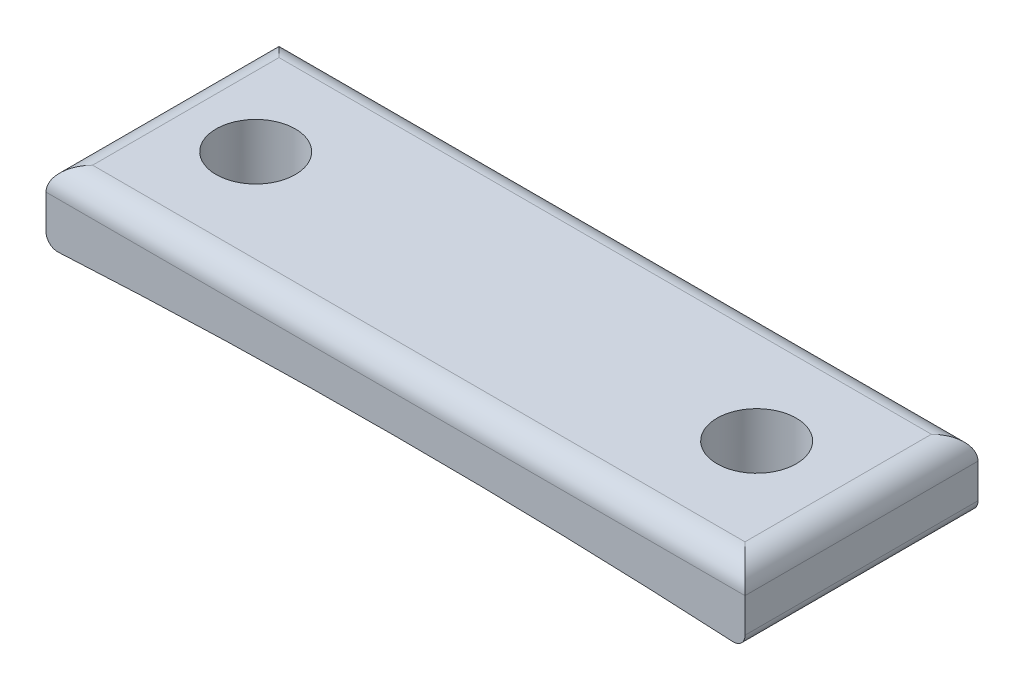
ISO-10303-21;
HEADER;
FILE_DESCRIPTION(('STEP AP214'),'2;1');
FILE_NAME('part.step','',(''),(''),'','','');
FILE_SCHEMA(('AUTOMOTIVE_DESIGN { 1 0 10303 214 1 1 1 1 }'));
ENDSEC;
DATA;
#1=APPLICATION_CONTEXT('core data for automotive mechanical design processes');
#2=APPLICATION_PROTOCOL_DEFINITION('international standard','automotive_design',2000,#1);
#3=PRODUCT_CONTEXT('',#1,'mechanical');
#4=PRODUCT('Part','Part','',(#3));
#5=PRODUCT_RELATED_PRODUCT_CATEGORY('part','',(#4));
#6=PRODUCT_DEFINITION_FORMATION('','',#4);
#7=PRODUCT_DEFINITION_CONTEXT('part definition',#1,'design');
#8=PRODUCT_DEFINITION('design','',#6,#7);
#9=PRODUCT_DEFINITION_SHAPE('','',#8);
#10=(LENGTH_UNIT() NAMED_UNIT(*) SI_UNIT(.MILLI.,.METRE.));
#11=(NAMED_UNIT(*) PLANE_ANGLE_UNIT() SI_UNIT($,.RADIAN.));
#12=(NAMED_UNIT(*) SI_UNIT($,.STERADIAN.) SOLID_ANGLE_UNIT());
#13=UNCERTAINTY_MEASURE_WITH_UNIT(LENGTH_MEASURE(1.E-05),#10,'distance_accuracy_value','');
#14=(GEOMETRIC_REPRESENTATION_CONTEXT(3) GLOBAL_UNCERTAINTY_ASSIGNED_CONTEXT((#13)) GLOBAL_UNIT_ASSIGNED_CONTEXT((#10,
#11,#12)) REPRESENTATION_CONTEXT('',''));
#15=CARTESIAN_POINT('',(0.,0.,0.));
#16=DIRECTION('',(0.,0.,1.));
#17=DIRECTION('',(1.,0.,0.));
#18=AXIS2_PLACEMENT_3D('',#15,#16,#17);
#19=CARTESIAN_POINT('',(-6.23076923076924,3.,-3.));
#20=DIRECTION('',(0.,0.,1.));
#21=DIRECTION('',(1.,0.,0.));
#22=AXIS2_PLACEMENT_3D('',#19,#20,#21);
#23=PLANE('',#22);
#24=DIRECTION('',(0.,-1.,0.));
#25=VECTOR('',#24,1.);
#26=CARTESIAN_POINT('',(23.7692307692308,3.,-3.00000000000001));
#27=LINE('',#26,#25);
#28=CARTESIAN_POINT('',(23.7692307692308,2.,-3.00000000000001));
#29=VERTEX_POINT('',#28);
#30=CARTESIAN_POINT('',(23.7692307692308,0.528725122012408,-3.00000000000001));
#31=VERTEX_POINT('',#30);
#32=EDGE_CURVE('E268',#29,#31,#27,.T.);
#33=ORIENTED_EDGE('',*,*,#32,.T.);
#34=CARTESIAN_POINT('',(23.2692307692308,0.528725122012408,-3.00000000000001));
#35=DIRECTION('',(0.,0.,1.));
#36=DIRECTION('',(1.,0.,0.));
#37=AXIS2_PLACEMENT_3D('',#34,#35,#36);
#38=CIRCLE('',#37,0.5);
#39=CARTESIAN_POINT('',(23.2418285598869,0.0294765677600339,-3.00000000000001));
#40=VERTEX_POINT('',#39);
#41=EDGE_CURVE('E257',#31,#40,#38,.F.);
#42=ORIENTED_EDGE('',*,*,#41,.T.);
#43=CARTESIAN_POINT('',(8.76923076923076,-263.650850539647,-3.00000000000001));
#44=DIRECTION('',(0.,0.,1.));
#45=DIRECTION('',(1.,0.,0.));
#46=AXIS2_PLACEMENT_3D('',#43,#44,#45);
#47=CIRCLE('',#46,264.077206495145);
#48=CARTESIAN_POINT('',(-5.70336702142536,0.0294765677600339,-3.00000000000001));
#49=VERTEX_POINT('',#48);
#50=EDGE_CURVE('E167',#40,#49,#47,.T.);
#51=ORIENTED_EDGE('',*,*,#50,.T.);
#52=CARTESIAN_POINT('',(-5.73076923076924,0.528725122012408,-3.));
#53=DIRECTION('',(0.,0.,1.));
#54=DIRECTION('',(1.,0.,0.));
#55=AXIS2_PLACEMENT_3D('',#52,#53,#54);
#56=CIRCLE('',#55,0.5);
#57=CARTESIAN_POINT('',(-6.23076923076924,0.528725122012408,-3.));
#58=VERTEX_POINT('',#57);
#59=EDGE_CURVE('E259',#49,#58,#56,.F.);
#60=ORIENTED_EDGE('',*,*,#59,.T.);
#61=DIRECTION('',(0.,-1.,0.));
#62=VECTOR('',#61,1.);
#63=CARTESIAN_POINT('',(-6.23076923076924,3.,-3.));
#64=LINE('',#63,#62);
#65=CARTESIAN_POINT('',(-6.23076923076924,2.,-3.));
#66=VERTEX_POINT('',#65);
#67=EDGE_CURVE('E142',#66,#58,#64,.T.);
#68=ORIENTED_EDGE('',*,*,#67,.F.);
#69=DIRECTION('',(-1.,0.,0.));
#70=VECTOR('',#69,1.);
#71=CARTESIAN_POINT('',(-6.23076923076924,2.,-3.));
#72=LINE('',#71,#70);
#73=EDGE_CURVE('E161',#66,#29,#72,.F.);
#74=ORIENTED_EDGE('',*,*,#73,.T.);
#75=EDGE_LOOP('',(#33,#42,#51,#60,#68,#74));
#76=FACE_BOUND('',#75,.T.);
#77=ADVANCED_FACE('F42',(#76),#23,.F.);
#78=CARTESIAN_POINT('',(-6.23076923076924,3.,-3.));
#79=DIRECTION('',(1.,0.,0.));
#80=DIRECTION('',(0.,0.,-1.));
#81=AXIS2_PLACEMENT_3D('',#78,#79,#80);
#82=PLANE('',#81);
#83=ORIENTED_EDGE('',*,*,#67,.T.);
#84=DIRECTION('',(0.,0.,-1.));
#85=VECTOR('',#84,1.);
#86=CARTESIAN_POINT('',(-6.23076923076924,0.528725122012408,-3.));
#87=LINE('',#86,#85);
#88=CARTESIAN_POINT('',(-6.23076923076924,0.528725122012408,7.));
#89=VERTEX_POINT('',#88);
#90=EDGE_CURVE('E11',#58,#89,#87,.F.);
#91=ORIENTED_EDGE('',*,*,#90,.T.);
#92=DIRECTION('',(0.,-1.,0.));
#93=VECTOR('',#92,1.);
#94=CARTESIAN_POINT('',(-6.23076923076924,3.,7.));
#95=LINE('',#94,#93);
#96=CARTESIAN_POINT('',(-6.23076923076924,2.,7.));
#97=VERTEX_POINT('',#96);
#98=EDGE_CURVE('E143',#97,#89,#95,.T.);
#99=ORIENTED_EDGE('',*,*,#98,.F.);
#100=DIRECTION('',(0.,0.,1.));
#101=VECTOR('',#100,1.);
#102=CARTESIAN_POINT('',(-6.23076923076924,2.,-3.));
#103=LINE('',#102,#101);
#104=EDGE_CURVE('E155',#97,#66,#103,.F.);
#105=ORIENTED_EDGE('',*,*,#104,.T.);
#106=EDGE_LOOP('',(#83,#91,#99,#105));
#107=FACE_BOUND('',#106,.T.);
#108=ADVANCED_FACE('F220',(#107),#82,.F.);
#109=CARTESIAN_POINT('',(-6.23076923076924,3.,7.));
#110=DIRECTION('',(0.,0.,-1.));
#111=DIRECTION('',(-1.,0.,0.));
#112=AXIS2_PLACEMENT_3D('',#109,#110,#111);
#113=PLANE('',#112);
#114=CARTESIAN_POINT('',(8.76923076923076,-263.650850539647,6.99999999999999));
#115=DIRECTION('',(0.,0.,-1.));
#116=DIRECTION('',(-1.,0.,0.));
#117=AXIS2_PLACEMENT_3D('',#114,#115,#116);
#118=CIRCLE('',#117,264.077206495145);
#119=CARTESIAN_POINT('',(-5.70336702142536,0.0294765677600339,7.));
#120=VERTEX_POINT('',#119);
#121=CARTESIAN_POINT('',(23.2418285598869,0.0294765677600339,6.99999999999999));
#122=VERTEX_POINT('',#121);
#123=EDGE_CURVE('E201',#120,#122,#118,.T.);
#124=ORIENTED_EDGE('',*,*,#123,.T.);
#125=CARTESIAN_POINT('',(23.2692307692308,0.528725122012408,6.99999999999999));
#126=DIRECTION('',(0.,0.,-1.));
#127=DIRECTION('',(-1.,0.,0.));
#128=AXIS2_PLACEMENT_3D('',#125,#126,#127);
#129=CIRCLE('',#128,0.5);
#130=CARTESIAN_POINT('',(23.7692307692308,0.528725122012408,6.99999999999999));
#131=VERTEX_POINT('',#130);
#132=EDGE_CURVE('E52',#122,#131,#129,.F.);
#133=ORIENTED_EDGE('',*,*,#132,.T.);
#134=DIRECTION('',(0.,-1.,0.));
#135=VECTOR('',#134,1.);
#136=CARTESIAN_POINT('',(23.7692307692308,3.,6.99999999999999));
#137=LINE('',#136,#135);
#138=CARTESIAN_POINT('',(23.7692307692308,2.,6.99999999999999));
#139=VERTEX_POINT('',#138);
#140=EDGE_CURVE('E270',#139,#131,#137,.T.);
#141=ORIENTED_EDGE('',*,*,#140,.F.);
#142=DIRECTION('',(1.,0.,0.));
#143=VECTOR('',#142,1.);
#144=CARTESIAN_POINT('',(-6.23076923076924,2.,7.));
#145=LINE('',#144,#143);
#146=EDGE_CURVE('E156',#139,#97,#145,.F.);
#147=ORIENTED_EDGE('',*,*,#146,.T.);
#148=ORIENTED_EDGE('',*,*,#98,.T.);
#149=CARTESIAN_POINT('',(-5.73076923076924,0.528725122012408,7.));
#150=DIRECTION('',(0.,0.,-1.));
#151=DIRECTION('',(-1.,0.,0.));
#152=AXIS2_PLACEMENT_3D('',#149,#150,#151);
#153=CIRCLE('',#152,0.5);
#154=EDGE_CURVE('E58',#89,#120,#153,.F.);
#155=ORIENTED_EDGE('',*,*,#154,.T.);
#156=EDGE_LOOP('',(#124,#133,#141,#147,#148,#155));
#157=FACE_BOUND('',#156,.T.);
#158=ADVANCED_FACE('F213',(#157),#113,.F.);
#159=CARTESIAN_POINT('',(23.7692307692308,3.,-3.00000000000001));
#160=DIRECTION('',(-1.,0.,0.));
#161=DIRECTION('',(0.,0.,1.));
#162=AXIS2_PLACEMENT_3D('',#159,#160,#161);
#163=PLANE('',#162);
#164=ORIENTED_EDGE('',*,*,#140,.T.);
#165=DIRECTION('',(0.,0.,-1.));
#166=VECTOR('',#165,1.);
#167=CARTESIAN_POINT('',(23.7692307692308,0.528725122012408,-3.00000000000001));
#168=LINE('',#167,#166);
#169=EDGE_CURVE('E168',#131,#31,#168,.T.);
#170=ORIENTED_EDGE('',*,*,#169,.T.);
#171=ORIENTED_EDGE('',*,*,#32,.F.);
#172=DIRECTION('',(0.,0.,-1.));
#173=VECTOR('',#172,1.);
#174=CARTESIAN_POINT('',(23.7692307692308,2.,-3.00000000000001));
#175=LINE('',#174,#173);
#176=EDGE_CURVE('E128',#29,#139,#175,.F.);
#177=ORIENTED_EDGE('',*,*,#176,.T.);
#178=EDGE_LOOP('',(#164,#170,#171,#177));
#179=FACE_BOUND('',#178,.T.);
#180=ADVANCED_FACE('F215',(#179),#163,.F.);
#181=CARTESIAN_POINT('',(0.,3.,0.));
#182=DIRECTION('',(0.,-1.,0.));
#183=DIRECTION('',(0.,0.,-1.));
#184=AXIS2_PLACEMENT_3D('',#181,#182,#183);
#185=PLANE('',#184);
#186=DIRECTION('',(-1.,0.,0.));
#187=VECTOR('',#186,1.);
#188=CARTESIAN_POINT('',(0.,3.,-2.00000000000001));
#189=LINE('',#188,#187);
#190=CARTESIAN_POINT('',(22.7692307692308,3.,-2.00000000000001));
#191=VERTEX_POINT('',#190);
#192=CARTESIAN_POINT('',(-5.23076923076924,3.,-2.));
#193=VERTEX_POINT('',#192);
#194=EDGE_CURVE('E120',#191,#193,#189,.T.);
#195=ORIENTED_EDGE('',*,*,#194,.T.);
#196=DIRECTION('',(0.,0.,1.));
#197=VECTOR('',#196,1.);
#198=CARTESIAN_POINT('',(-5.23076923076924,3.,0.));
#199=LINE('',#198,#197);
#200=CARTESIAN_POINT('',(-5.23076923076924,3.,6.));
#201=VERTEX_POINT('',#200);
#202=EDGE_CURVE('E153',#193,#201,#199,.T.);
#203=ORIENTED_EDGE('',*,*,#202,.T.);
#204=DIRECTION('',(1.,0.,0.));
#205=VECTOR('',#204,1.);
#206=CARTESIAN_POINT('',(0.,3.,5.99999999999999));
#207=LINE('',#206,#205);
#208=CARTESIAN_POINT('',(22.7692307692308,3.,5.99999999999999));
#209=VERTEX_POINT('',#208);
#210=EDGE_CURVE('E119',#201,#209,#207,.T.);
#211=ORIENTED_EDGE('',*,*,#210,.T.);
#212=DIRECTION('',(0.,0.,-1.));
#213=VECTOR('',#212,1.);
#214=CARTESIAN_POINT('',(22.7692307692308,3.,0.));
#215=LINE('',#214,#213);
#216=EDGE_CURVE('E111',#209,#191,#215,.T.);
#217=ORIENTED_EDGE('',*,*,#216,.T.);
#218=EDGE_LOOP('',(#195,#203,#211,#217));
#219=FACE_BOUND('',#218,.T.);
#220=CARTESIAN_POINT('',(-2.23076923076924,3.,1.99999999999999));
#221=DIRECTION('',(0.,1.,0.));
#222=DIRECTION('',(0.,0.,1.));
#223=AXIS2_PLACEMENT_3D('',#220,#221,#222);
#224=CIRCLE('',#223,1.69999999999999);
#225=CARTESIAN_POINT('',(-2.23076923076924,3.,3.69999999999998));
#226=VERTEX_POINT('',#225);
#227=EDGE_CURVE('E135',#226,#226,#224,.T.);
#228=ORIENTED_EDGE('',*,*,#227,.F.);
#229=EDGE_LOOP('',(#228));
#230=FACE_BOUND('',#229,.T.);
#231=CARTESIAN_POINT('',(19.2692307692308,3.,1.99999999999999));
#232=DIRECTION('',(0.,1.,0.));
#233=DIRECTION('',(0.,0.,1.));
#234=AXIS2_PLACEMENT_3D('',#231,#232,#233);
#235=CIRCLE('',#234,1.69999999999999);
#236=CARTESIAN_POINT('',(19.2692307692308,3.,3.69999999999998));
#237=VERTEX_POINT('',#236);
#238=EDGE_CURVE('E269',#237,#237,#235,.T.);
#239=ORIENTED_EDGE('',*,*,#238,.F.);
#240=EDGE_LOOP('',(#239));
#241=FACE_BOUND('',#240,.T.);
#242=ADVANCED_FACE('F113',(#219,#230,#241),#185,.F.);
#243=CARTESIAN_POINT('',(19.2692307692308,3.,1.99999999999999));
#244=DIRECTION('',(0.,1.,0.));
#245=DIRECTION('',(0.,0.,1.));
#246=AXIS2_PLACEMENT_3D('',#243,#244,#245);
#247=CYLINDRICAL_SURFACE('',#246,1.69999999999999);
#248=CARTESIAN_POINT('',(19.2692307692308,0.21752761559779,3.69999999999998));
#249=CARTESIAN_POINT('',(19.1737012728925,0.221328905286213,3.69999577567921));
#250=CARTESIAN_POINT('',(19.0781005697623,0.225080659722475,3.69192085019014));
#251=CARTESIAN_POINT('',(18.8895268608054,0.232380324640586,3.65981727471278));
#252=CARTESIAN_POINT('',(18.7965571483607,0.235927984922403,3.63576947805143));
#253=CARTESIAN_POINT('',(18.6160038119118,0.24272689201825,3.57239945355122));
#254=CARTESIAN_POINT('',(18.5284177622098,0.245978272649338,3.53308416403856));
#255=CARTESIAN_POINT('',(18.3611103400869,0.252112410003391,3.44030086366055));
#256=CARTESIAN_POINT('',(18.2813870104002,0.254995258518194,3.38683638721825));
#257=CARTESIAN_POINT('',(18.1320707515184,0.260334913241185,3.26728473868568));
#258=CARTESIAN_POINT('',(18.0624745238992,0.262791858217386,3.20120169278488));
#259=CARTESIAN_POINT('',(17.9353620927938,0.267237287994016,3.05827280516966));
#260=CARTESIAN_POINT('',(17.877846324719,0.26922575590962,2.98142657568828));
#261=CARTESIAN_POINT('',(17.7765712684265,0.272701616755436,2.81920956897948));
#262=CARTESIAN_POINT('',(17.7328029115376,0.274189340055388,2.73384446053803));
#263=CARTESIAN_POINT('',(17.6602183040142,0.276644537019662,2.55697124087479));
#264=CARTESIAN_POINT('',(17.6314019803059,0.277612013226541,2.46546315967745));
#265=CARTESIAN_POINT('',(17.5895527391968,0.279013919581445,2.27894835836667));
#266=CARTESIAN_POINT('',(17.5765123140892,0.279448603285255,2.1839433246426));
#267=CARTESIAN_POINT('',(17.5665613739132,0.279780480087532,1.99309154467544));
#268=CARTESIAN_POINT('',(17.5696508044206,0.279677674999555,1.89724480127349));
#269=CARTESIAN_POINT('',(17.5918691137832,0.27893588819058,1.70745114644176));
#270=CARTESIAN_POINT('',(17.6109946702566,0.278297017532198,1.61350384561209));
#271=CARTESIAN_POINT('',(17.6647362095964,0.276491147590354,1.43015487148919));
#272=CARTESIAN_POINT('',(17.6993522068269,0.275324147817167,1.34075320241115));
#273=CARTESIAN_POINT('',(17.7830931222823,0.272477384036953,1.1690236840066));
#274=CARTESIAN_POINT('',(17.8322193861135,0.270797572473957,1.08669649164456));
#275=CARTESIAN_POINT('',(17.943581762789,0.266949859860272,0.931459021025129));
#276=CARTESIAN_POINT('',(18.0058178896139,0.264781958289071,0.858548752810366));
#277=CARTESIAN_POINT('',(18.1416566828343,0.25999279989344,0.724183920295087));
#278=CARTESIAN_POINT('',(18.2152636766477,0.257371370423869,0.662733737100684));
#279=CARTESIAN_POINT('',(18.3717350276118,0.25172432594957,0.553062102510057));
#280=CARTESIAN_POINT('',(18.4545994134747,0.248698709691237,0.504840692144926));
#281=CARTESIAN_POINT('',(18.6272851797925,0.242304382273894,0.422964065692387));
#282=CARTESIAN_POINT('',(18.7171106967469,0.238935466736561,0.38931758990642));
#283=CARTESIAN_POINT('',(18.9011256313478,0.231934364504333,0.337582111873831));
#284=CARTESIAN_POINT('',(18.9953150652867,0.22830217682651,0.319493167714646));
#285=CARTESIAN_POINT('',(19.1854482162926,0.220865374016164,0.299375074911694));
#286=CARTESIAN_POINT('',(19.2813930182857,0.217060649939264,0.297356219476106));
#287=CARTESIAN_POINT('',(19.4722565122044,0.209387756446506,0.309460300650276));
#288=CARTESIAN_POINT('',(19.5671752009789,0.205519586835913,0.323583286813717));
#289=CARTESIAN_POINT('',(19.7533317203245,0.197835648533632,0.367579300954004));
#290=CARTESIAN_POINT('',(19.8445680741142,0.194019901262455,0.397458581652909));
#291=CARTESIAN_POINT('',(20.0207297019615,0.186566333256928,0.472125216217734));
#292=CARTESIAN_POINT('',(20.1056549746821,0.182928512560273,0.516912573242048));
#293=CARTESIAN_POINT('',(20.2667710128611,0.175956418369531,0.620121412350726));
#294=CARTESIAN_POINT('',(20.3429628627807,0.172622107198162,0.678541198905504));
#295=CARTESIAN_POINT('',(20.4844558741329,0.166376943560363,0.807363547597683));
#296=CARTESIAN_POINT('',(20.5497570668114,0.163466089879013,0.877766075354772));
#297=CARTESIAN_POINT('',(20.6675652185832,0.158179087255433,1.0285039747633));
#298=CARTESIAN_POINT('',(20.720081132252,0.155802564167561,1.10883233475366));
#299=CARTESIAN_POINT('',(20.8108790354541,0.151673656036861,1.27718131029429));
#300=CARTESIAN_POINT('',(20.8491611195682,0.149921266846794,1.36520187472663));
#301=CARTESIAN_POINT('',(20.9103667832961,0.14711145188105,1.54634441254904));
#302=CARTESIAN_POINT('',(20.9333053400169,0.146053348419221,1.63946131494966));
#303=CARTESIAN_POINT('',(20.9632281180184,0.144671876429605,1.82822958032748));
#304=CARTESIAN_POINT('',(20.9702123866028,0.144348505723367,1.92388093578928));
#305=CARTESIAN_POINT('',(20.9680276252332,0.144449544343232,2.11493061463464));
#306=CARTESIAN_POINT('',(20.9588700169943,0.144873424927167,2.21032906913583));
#307=CARTESIAN_POINT('',(20.9246853193592,0.146450818423652,2.39823274638057));
#308=CARTESIAN_POINT('',(20.8996582135632,0.14760433209022,2.49073796613408));
#309=CARTESIAN_POINT('',(20.834448467364,0.150594813451669,2.67023237088604));
#310=CARTESIAN_POINT('',(20.7942655730284,0.152431792597877,2.75722146343431));
#311=CARTESIAN_POINT('',(20.6998910830266,0.156716744154397,2.92321490008899));
#312=CARTESIAN_POINT('',(20.6456999918184,0.159164694562528,3.00221953158638));
#313=CARTESIAN_POINT('',(20.5248139713457,0.164579081963754,3.15005834021462));
#314=CARTESIAN_POINT('',(20.4581115898967,0.167545827898873,3.21888641189119));
#315=CARTESIAN_POINT('',(20.3140975982822,0.173887162853468,3.34438716641942));
#316=CARTESIAN_POINT('',(20.2367833029829,0.177261855069775,3.40105676347918));
#317=CARTESIAN_POINT('',(20.0736443776624,0.184302339179672,3.50069030028038));
#318=CARTESIAN_POINT('',(19.9878075436664,0.187968546973617,3.54363420323971));
#319=CARTESIAN_POINT('',(19.8102159583968,0.195459842419506,3.61445124465941));
#320=CARTESIAN_POINT('',(19.7184684084999,0.199284734785987,3.64234234819711));
#321=CARTESIAN_POINT('',(19.5666546776039,0.205530982228648,3.67484941854181));
#322=CARTESIAN_POINT('',(19.5075735087233,0.207942227365364,3.68426902729617));
#323=CARTESIAN_POINT('',(19.3887477755995,0.21275131781863,3.69684564131416));
#324=CARTESIAN_POINT('',(19.3290032109923,0.215149163127827,3.70000264314139));
#325=CARTESIAN_POINT('',(19.2692307692308,0.21752761559779,3.69999999999998));
#326=B_SPLINE_CURVE_WITH_KNOTS('',3,(#248,#249,#250,#251,#252,#253,#254,#255,#256,#257,#258,
#259,#260,#261,#262,#263,#264,#265,#266,#267,#268,#269,#270,#271,#272,#273,#274,#275,#276,#277,
#278,#279,#280,#281,#282,#283,#284,#285,#286,#287,#288,#289,#290,#291,#292,#293,#294,#295,#296,
#297,#298,#299,#300,#301,#302,#303,#304,#305,#306,#307,#308,#309,#310,#311,#312,#313,#314,#315,
#316,#317,#318,#319,#320,#321,#322,#323,#324,#325),.UNSPECIFIED.,.T.,.F.,(4,2,2,2,2,2,2,2,2,2,2,
2,2,2,2,2,2,2,2,2,2,2,2,2,2,2,2,2,2,2,2,2,2,2,2,2,2,2,4),(0.,0.28659709239848,0.573538350083817,
0.860349359364857,1.14708879165807,1.43373462210462,1.72039078224493,2.00685744657352,
2.29332271086716,2.57965159343283,2.86597950988913,3.15224811927666,3.4385169941168,
3.72481242437528,4.01110815994909,4.29751312091607,4.58391897020244,4.8704963344693,
5.15707476873059,5.44383674736186,5.73059960632331,6.01747634988447,6.30435315422275,
6.59119429733857,6.87803461747728,7.16467345819197,7.45131039421577,7.73766712861122,
8.02402301397011,8.3101763601464,8.59633000203992,8.88248843859651,9.1686365715567,
9.4549556892505,9.74134738831915,10.028155272767,10.3146200991413,10.4939427091331,
10.6732654175222),.UNSPECIFIED.);
#327=CARTESIAN_POINT('',(19.2692307692308,0.21752761559779,3.69999999999998));
#328=VERTEX_POINT('',#327);
#329=EDGE_CURVE('E183',#328,#328,#326,.T.);
#330=ORIENTED_EDGE('',*,*,#329,.T.);
#331=EDGE_LOOP('',(#330));
#332=FACE_BOUND('',#331,.T.);
#333=ORIENTED_EDGE('',*,*,#238,.T.);
#334=EDGE_LOOP('',(#333));
#335=FACE_BOUND('',#334,.T.);
#336=ADVANCED_FACE('F202',(#332,#335),#247,.F.);
#337=CARTESIAN_POINT('',(-2.23076923076924,3.,1.99999999999999));
#338=DIRECTION('',(0.,1.,0.));
#339=DIRECTION('',(0.,0.,1.));
#340=AXIS2_PLACEMENT_3D('',#337,#338,#339);
#341=CYLINDRICAL_SURFACE('',#340,1.69999999999999);
#342=CARTESIAN_POINT('',(-2.23076923076924,0.197156824970568,3.69999999999998));
#343=CARTESIAN_POINT('',(-2.32633566888941,0.193172521865094,3.69999577005118));
#344=CARTESIAN_POINT('',(-2.42196925893151,0.189132997575265,3.69191458514017));
#345=CARTESIAN_POINT('',(-2.61059921788112,0.181064516594525,3.6597901689771));
#346=CARTESIAN_POINT('',(-2.70359226416715,0.1770355785449,3.63572768235288));
#347=CARTESIAN_POINT('',(-2.88418243790953,0.169120495456844,3.57232342951967));
#348=CARTESIAN_POINT('',(-2.97178206458487,0.165234284623069,3.53298880284548));
#349=CARTESIAN_POINT('',(-3.1391104541378,0.157734277097893,3.44016292451265));
#350=CARTESIAN_POINT('',(-3.21884118077606,0.154120412493329,3.38667521722116));
#351=CARTESIAN_POINT('',(-3.36817922103265,0.147291730892059,3.26706299934049));
#352=CARTESIAN_POINT('',(-3.43778829460889,0.1440768445351,3.20094069030014));
#353=CARTESIAN_POINT('',(-3.56491759896025,0.138163323630086,3.05792364436039));
#354=CARTESIAN_POINT('',(-3.62243740638232,0.135464707161543,2.98102853036609));
#355=CARTESIAN_POINT('',(-3.72369474610566,0.130688577262341,2.81872679915666));
#356=CARTESIAN_POINT('',(-3.76744510554833,0.128610485865023,2.73332820172387));
#357=CARTESIAN_POINT('',(-3.83998607590148,0.125152855830912,2.5563845549825));
#358=CARTESIAN_POINT('',(-3.86877681048339,0.123773311419223,2.46483955649337));
#359=CARTESIAN_POINT('',(-3.91055294896924,0.121768427314551,2.27830303620304));
#360=CARTESIAN_POINT('',(-3.92355462734578,0.121142311036222,2.18331516733413));
#361=CARTESIAN_POINT('',(-3.93343490582744,0.120666688222462,1.99250297773491));
#362=CARTESIAN_POINT('',(-3.93031360127078,0.12081717709482,1.89667866195401));
#363=CARTESIAN_POINT('',(-3.90804368972334,0.121888431064463,1.70696973178755));
#364=CARTESIAN_POINT('',(-3.88890400195767,0.122808767501378,1.61308406774117));
#365=CARTESIAN_POINT('',(-3.83515583627098,0.125382556588826,1.4298609355947));
#366=CARTESIAN_POINT('',(-3.80054733535464,0.127036010329183,1.34052347425602));
#367=CARTESIAN_POINT('',(-3.71683775733175,0.131011669424054,1.16890570638145));
#368=CARTESIAN_POINT('',(-3.66773290100509,0.133334049164668,1.08662724736545));
#369=CARTESIAN_POINT('',(-3.55643233654211,0.138558104066882,0.931481409376641));
#370=CARTESIAN_POINT('',(-3.49423657390293,0.141459781640337,0.85861406958826));
#371=CARTESIAN_POINT('',(-3.35845859479615,0.147736933547574,0.724286509743956));
#372=CARTESIAN_POINT('',(-3.28486599166358,0.151112839812695,0.662836808819268));
#373=CARTESIAN_POINT('',(-3.12842526639755,0.158214679704716,0.553162289372736));
#374=CARTESIAN_POINT('',(-3.04557708891041,0.161940615424974,0.504937549949773));
#375=CARTESIAN_POINT('',(-2.87288407756284,0.169618002129292,0.423031160929597));
#376=CARTESIAN_POINT('',(-2.78303213760828,0.17356968104013,0.389364514917058));
#377=CARTESIAN_POINT('',(-2.59895450588993,0.181565655395594,0.337597883049052));
#378=CARTESIAN_POINT('',(-2.50472879707741,0.185609951201204,0.319497957877281));
#379=CARTESIAN_POINT('',(-2.31451743433191,0.193669169089475,0.299371291239654));
#380=CARTESIAN_POINT('',(-2.21853076053131,0.197684072137214,0.297354178914223));
#381=CARTESIAN_POINT('',(-2.0275770318224,0.205566976353897,0.309477739959428));
#382=CARTESIAN_POINT('',(-1.93260997745939,0.209434977444278,0.323618421971042));
#383=CARTESIAN_POINT('',(-1.74639739135298,0.216921728979193,0.367659001423297));
#384=CARTESIAN_POINT('',(-1.65515168438736,0.220540491164851,0.397558155940271));
#385=CARTESIAN_POINT('',(-1.47897177536003,0.227441698618073,0.472271015970569));
#386=CARTESIAN_POINT('',(-1.39403755711731,0.230724144747872,0.517084683245364));
#387=CARTESIAN_POINT('',(-1.23294284008678,0.236879408813094,0.620329647942855));
#388=CARTESIAN_POINT('',(-1.15677758434555,0.239752449044483,0.678753509653055));
#389=CARTESIAN_POINT('',(-1.01533658747491,0.245034709369912,0.807576579310537));
#390=CARTESIAN_POINT('',(-0.950060810264482,0.247443931000766,0.87797574757746));
#391=CARTESIAN_POINT('',(-0.832302568222946,0.25175465323542,1.02869654777764));
#392=CARTESIAN_POINT('',(-0.779810927729678,0.253656518082562,1.10901100037118));
#393=CARTESIAN_POINT('',(-0.689056432672947,0.25692476185223,1.27732246641103));
#394=CARTESIAN_POINT('',(-0.650793514038686,0.258291143185999,1.36531944526134));
#395=CARTESIAN_POINT('',(-0.589606466108436,0.260468086869963,1.54644028391988));
#396=CARTESIAN_POINT('',(-0.566673006327484,0.261278987328669,1.63956098767349));
#397=CARTESIAN_POINT('',(-0.536761215163749,0.262335434259977,1.82833384135307));
#398=CARTESIAN_POINT('',(-0.529782876213286,0.262580981000732,1.92398599007833));
#399=CARTESIAN_POINT('',(-0.531979934442563,0.262503557183935,2.11507197551125));
#400=CARTESIAN_POINT('',(-0.541149890651819,0.262180778116818,2.21050587490743));
#401=CARTESIAN_POINT('',(-0.57537171454305,0.2609712568006,2.39847871502647));
#402=CARTESIAN_POINT('',(-0.600423604104343,0.26008451377457,2.49101765176097));
#403=CARTESIAN_POINT('',(-0.665696174320167,0.257759026693997,2.67057583978882));
#404=CARTESIAN_POINT('',(-0.705917120003493,0.256320272994897,2.75759499461131));
#405=CARTESIAN_POINT('',(-0.800380949520233,0.252911740809765,2.92364092738977));
#406=CARTESIAN_POINT('',(-0.854623297936399,0.250941982600396,3.00266801036842));
#407=CARTESIAN_POINT('',(-0.975600653838902,0.246502431438886,3.15051195224682));
#408=CARTESIAN_POINT('',(-1.04233850988906,0.244032524458825,3.21932647659481));
#409=CARTESIAN_POINT('',(-1.18642278047693,0.238636061309535,3.34479249563517));
#410=CARTESIAN_POINT('',(-1.26377185504705,0.235709390612852,3.40144093135451));
#411=CARTESIAN_POINT('',(-1.42694503201665,0.22945501270739,3.50100475651013));
#412=CARTESIAN_POINT('',(-1.51277823267946,0.226126874108432,3.54390518905196));
#413=CARTESIAN_POINT('',(-1.69034869342426,0.219147849551134,3.61463884956602));
#414=CARTESIAN_POINT('',(-1.78207876334409,0.215497354691076,3.6424900515641));
#415=CARTESIAN_POINT('',(-1.93378749686788,0.209377276670072,3.67492482381886));
#416=CARTESIAN_POINT('',(-1.99278434098261,0.206977742484605,3.68431647487288));
#417=CARTESIAN_POINT('',(-2.11143513741305,0.202111592364694,3.69685538474703));
#418=CARTESIAN_POINT('',(-2.17108908994058,0.199644976408626,3.70000264155433));
#419=CARTESIAN_POINT('',(-2.23076923076924,0.197156824970568,3.69999999999998));
#420=B_SPLINE_CURVE_WITH_KNOTS('',3,(#342,#343,#344,#345,#346,#347,#348,#349,#350,#351,#352,
#353,#354,#355,#356,#357,#358,#359,#360,#361,#362,#363,#364,#365,#366,#367,#368,#369,#370,#371,
#372,#373,#374,#375,#376,#377,#378,#379,#380,#381,#382,#383,#384,#385,#386,#387,#388,#389,#390,
#391,#392,#393,#394,#395,#396,#397,#398,#399,#400,#401,#402,#403,#404,#405,#406,#407,#408,#409,
#410,#411,#412,#413,#414,#415,#416,#417,#418,#419),.UNSPECIFIED.,.T.,.F.,(4,2,2,2,2,2,2,2,2,2,2,
2,2,2,2,2,2,2,2,2,2,2,2,2,2,2,2,2,2,2,2,2,2,2,2,2,2,2,4),(0.,0.286730389956614,
0.573806880675109,0.860749327994931,1.14761998398977,1.43444069897427,1.72127145643756,
2.00783421593161,2.29439460636985,2.58065937505772,2.86692245101028,3.15302623826376,
3.4391304508293,3.72530931713047,4.01148937493618,4.29793179858298,4.58437593541291,
4.87111458230305,5.15785434698042,5.44476577629802,5.73167735905218,6.01857541674285,
6.30547273887645,6.59221368531623,6.87895368165407,7.16548726321301,7.45201955451847,
7.73837728482817,8.02473487931535,8.31099600757445,8.59725753019434,8.88352405451377,
9.16977964915649,9.45610058026832,9.74249341824287,10.0291967826796,10.3155569622292,
10.4946167333492,10.6736765621873),.UNSPECIFIED.);
#421=CARTESIAN_POINT('',(-2.23076923076924,0.197156824970568,3.69999999999998));
#422=VERTEX_POINT('',#421);
#423=EDGE_CURVE('E174',#422,#422,#420,.T.);
#424=ORIENTED_EDGE('',*,*,#423,.T.);
#425=EDGE_LOOP('',(#424));
#426=FACE_BOUND('',#425,.T.);
#427=ORIENTED_EDGE('',*,*,#227,.T.);
#428=EDGE_LOOP('',(#427));
#429=FACE_BOUND('',#428,.T.);
#430=ADVANCED_FACE('F187',(#426,#429),#341,.F.);
#431=CARTESIAN_POINT('',(22.7692307692308,2.,0.));
#432=DIRECTION('',(0.,0.,-1.));
#433=DIRECTION('',(-1.,0.,0.));
#434=AXIS2_PLACEMENT_3D('',#431,#432,#433);
#435=CYLINDRICAL_SURFACE('',#434,1.);
#436=CARTESIAN_POINT('',(22.7692307692308,2.,5.99999999999999));
#437=DIRECTION('',(0.707106781186547,0.,-0.707106781186548));
#438=DIRECTION('',(-0.707106781186548,0.,-0.707106781186547));
#439=AXIS2_PLACEMENT_3D('',#436,#437,#438);
#440=ELLIPSE('',#439,1.41421356237309,1.);
#441=EDGE_CURVE('E131',#139,#209,#440,.F.);
#442=ORIENTED_EDGE('',*,*,#441,.F.);
#443=ORIENTED_EDGE('',*,*,#176,.F.);
#444=CARTESIAN_POINT('',(22.7692307692308,2.,-2.00000000000001));
#445=DIRECTION('',(-0.707106781186548,0.,-0.707106781186547));
#446=DIRECTION('',(-0.707106781186547,0.,0.707106781186548));
#447=AXIS2_PLACEMENT_3D('',#444,#445,#446);
#448=ELLIPSE('',#447,1.4142135623731,1.);
#449=EDGE_CURVE('E129',#191,#29,#448,.T.);
#450=ORIENTED_EDGE('',*,*,#449,.F.);
#451=ORIENTED_EDGE('',*,*,#216,.F.);
#452=EDGE_LOOP('',(#442,#443,#450,#451));
#453=FACE_BOUND('',#452,.T.);
#454=ADVANCED_FACE('F126',(#453),#435,.T.);
#455=CARTESIAN_POINT('',(0.,2.,-2.00000000000001));
#456=DIRECTION('',(-1.,0.,0.));
#457=DIRECTION('',(0.,0.,1.));
#458=AXIS2_PLACEMENT_3D('',#455,#456,#457);
#459=CYLINDRICAL_SURFACE('',#458,1.);
#460=ORIENTED_EDGE('',*,*,#449,.T.);
#461=ORIENTED_EDGE('',*,*,#73,.F.);
#462=CARTESIAN_POINT('',(-5.23076923076924,2.,-2.));
#463=DIRECTION('',(-0.707106781186547,0.,0.707106781186548));
#464=DIRECTION('',(-0.707106781186548,0.,-0.707106781186547));
#465=AXIS2_PLACEMENT_3D('',#462,#463,#464);
#466=ELLIPSE('',#465,1.41421356237309,1.);
#467=EDGE_CURVE('E136',#193,#66,#466,.T.);
#468=ORIENTED_EDGE('',*,*,#467,.F.);
#469=ORIENTED_EDGE('',*,*,#194,.F.);
#470=EDGE_LOOP('',(#460,#461,#468,#469));
#471=FACE_BOUND('',#470,.T.);
#472=ADVANCED_FACE('F140',(#471),#459,.T.);
#473=CARTESIAN_POINT('',(0.,2.,5.99999999999999));
#474=DIRECTION('',(1.,0.,0.));
#475=DIRECTION('',(0.,0.,-1.));
#476=AXIS2_PLACEMENT_3D('',#473,#474,#475);
#477=CYLINDRICAL_SURFACE('',#476,1.);
#478=ORIENTED_EDGE('',*,*,#441,.T.);
#479=ORIENTED_EDGE('',*,*,#210,.F.);
#480=CARTESIAN_POINT('',(-5.23076923076924,2.,6.));
#481=DIRECTION('',(0.707106781186548,0.,0.707106781186547));
#482=DIRECTION('',(0.707106781186547,0.,-0.707106781186548));
#483=AXIS2_PLACEMENT_3D('',#480,#481,#482);
#484=ELLIPSE('',#483,1.4142135623731,1.);
#485=EDGE_CURVE('E170',#97,#201,#484,.F.);
#486=ORIENTED_EDGE('',*,*,#485,.F.);
#487=ORIENTED_EDGE('',*,*,#146,.F.);
#488=EDGE_LOOP('',(#478,#479,#486,#487));
#489=FACE_BOUND('',#488,.T.);
#490=ADVANCED_FACE('F230',(#489),#477,.T.);
#491=CARTESIAN_POINT('',(-5.23076923076924,2.,0.));
#492=DIRECTION('',(0.,0.,1.));
#493=DIRECTION('',(1.,0.,0.));
#494=AXIS2_PLACEMENT_3D('',#491,#492,#493);
#495=CYLINDRICAL_SURFACE('',#494,1.);
#496=ORIENTED_EDGE('',*,*,#467,.T.);
#497=ORIENTED_EDGE('',*,*,#104,.F.);
#498=ORIENTED_EDGE('',*,*,#485,.T.);
#499=ORIENTED_EDGE('',*,*,#202,.F.);
#500=EDGE_LOOP('',(#496,#497,#498,#499));
#501=FACE_BOUND('',#500,.T.);
#502=ADVANCED_FACE('F194',(#501),#495,.T.);
#503=CARTESIAN_POINT('',(8.76923076923076,-263.650850539647,59.2059504356715));
#504=DIRECTION('',(0.,0.,-1.));
#505=DIRECTION('',(-1.,0.,0.));
#506=AXIS2_PLACEMENT_3D('',#503,#504,#505);
#507=CYLINDRICAL_SURFACE('',#506,264.077206495145);
#508=ORIENTED_EDGE('',*,*,#423,.F.);
#509=EDGE_LOOP('',(#508));
#510=FACE_BOUND('',#509,.T.);
#511=ORIENTED_EDGE('',*,*,#329,.F.);
#512=EDGE_LOOP('',(#511));
#513=FACE_BOUND('',#512,.T.);
#514=ORIENTED_EDGE('',*,*,#50,.F.);
#515=DIRECTION('',(0.,0.,-1.));
#516=VECTOR('',#515,1.);
#517=CARTESIAN_POINT('',(23.2418285598869,0.0294765677600894,59.2059504356715));
#518=LINE('',#517,#516);
#519=EDGE_CURVE('E69',#40,#122,#518,.F.);
#520=ORIENTED_EDGE('',*,*,#519,.T.);
#521=ORIENTED_EDGE('',*,*,#123,.F.);
#522=DIRECTION('',(0.,0.,-1.));
#523=VECTOR('',#522,1.);
#524=CARTESIAN_POINT('',(-5.70336702142536,0.0294765677600894,59.2059504356715));
#525=LINE('',#524,#523);
#526=EDGE_CURVE('E254',#120,#49,#525,.T.);
#527=ORIENTED_EDGE('',*,*,#526,.T.);
#528=EDGE_LOOP('',(#514,#520,#521,#527));
#529=FACE_BOUND('',#528,.T.);
#530=ADVANCED_FACE('F186',(#510,#513,#529),#507,.F.);
#531=CARTESIAN_POINT('',(23.2692307692308,0.528725122012408,59.2059504356715));
#532=DIRECTION('',(0.,0.,-1.));
#533=DIRECTION('',(-1.,0.,0.));
#534=AXIS2_PLACEMENT_3D('',#531,#532,#533);
#535=CYLINDRICAL_SURFACE('',#534,0.5);
#536=ORIENTED_EDGE('',*,*,#132,.F.);
#537=ORIENTED_EDGE('',*,*,#519,.F.);
#538=ORIENTED_EDGE('',*,*,#41,.F.);
#539=ORIENTED_EDGE('',*,*,#169,.F.);
#540=EDGE_LOOP('',(#536,#537,#538,#539));
#541=FACE_BOUND('',#540,.T.);
#542=ADVANCED_FACE('F195',(#541),#535,.T.);
#543=CARTESIAN_POINT('',(-5.73076923076924,0.528725122012408,59.2059504356715));
#544=DIRECTION('',(0.,0.,-1.));
#545=DIRECTION('',(-1.,0.,0.));
#546=AXIS2_PLACEMENT_3D('',#543,#544,#545);
#547=CYLINDRICAL_SURFACE('',#546,0.5);
#548=ORIENTED_EDGE('',*,*,#59,.F.);
#549=ORIENTED_EDGE('',*,*,#526,.F.);
#550=ORIENTED_EDGE('',*,*,#154,.F.);
#551=ORIENTED_EDGE('',*,*,#90,.F.);
#552=EDGE_LOOP('',(#548,#549,#550,#551));
#553=FACE_BOUND('',#552,.T.);
#554=ADVANCED_FACE('F46',(#553),#547,.T.);
#555=CLOSED_SHELL('',(#77,#108,#158,#180,#242,#336,#430,#454,#472,#490,#502,#530,#542,#554));
#556=MANIFOLD_SOLID_BREP('B2',#555);
#557=ADVANCED_BREP_SHAPE_REPRESENTATION('',(#18,#556),#14);
#558=SHAPE_DEFINITION_REPRESENTATION(#9,#557);
ENDSEC;
END-ISO-10303-21;
